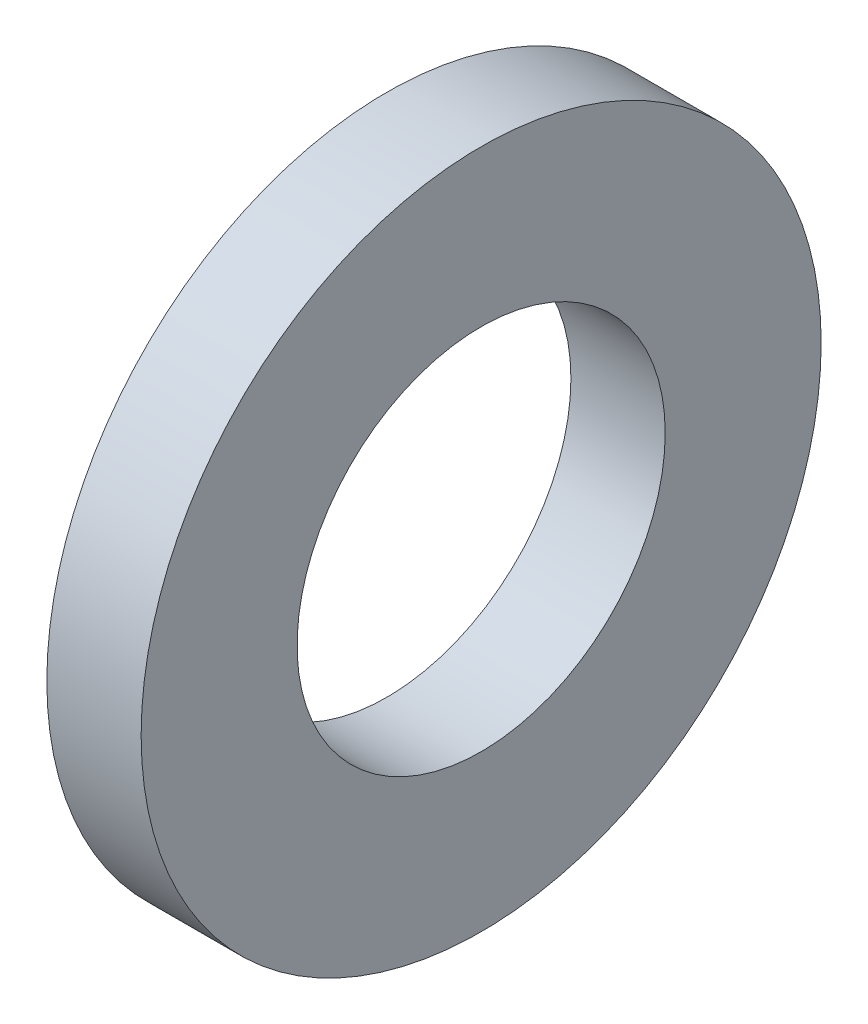
ISO-10303-21;
HEADER;
FILE_DESCRIPTION(('STEP AP214'),'2;1');
FILE_NAME('part.step','',(''),(''),'','','');
FILE_SCHEMA(('AUTOMOTIVE_DESIGN { 1 0 10303 214 1 1 1 1 }'));
ENDSEC;
DATA;
#1=APPLICATION_CONTEXT('core data for automotive mechanical design processes');
#2=APPLICATION_PROTOCOL_DEFINITION('international standard','automotive_design',2000,#1);
#3=PRODUCT_CONTEXT('',#1,'mechanical');
#4=PRODUCT('Part','Part','',(#3));
#5=PRODUCT_RELATED_PRODUCT_CATEGORY('part','',(#4));
#6=PRODUCT_DEFINITION_FORMATION('','',#4);
#7=PRODUCT_DEFINITION_CONTEXT('part definition',#1,'design');
#8=PRODUCT_DEFINITION('design','',#6,#7);
#9=PRODUCT_DEFINITION_SHAPE('','',#8);
#10=(LENGTH_UNIT() NAMED_UNIT(*) SI_UNIT(.MILLI.,.METRE.));
#11=(NAMED_UNIT(*) PLANE_ANGLE_UNIT() SI_UNIT($,.RADIAN.));
#12=(NAMED_UNIT(*) SI_UNIT($,.STERADIAN.) SOLID_ANGLE_UNIT());
#13=UNCERTAINTY_MEASURE_WITH_UNIT(LENGTH_MEASURE(1.E-05),#10,'distance_accuracy_value','');
#14=(GEOMETRIC_REPRESENTATION_CONTEXT(3) GLOBAL_UNCERTAINTY_ASSIGNED_CONTEXT((#13)) GLOBAL_UNIT_ASSIGNED_CONTEXT((#10,
#11,#12)) REPRESENTATION_CONTEXT('',''));
#15=CARTESIAN_POINT('',(0.,0.,0.));
#16=DIRECTION('',(0.,0.,1.));
#17=DIRECTION('',(1.,0.,0.));
#18=AXIS2_PLACEMENT_3D('',#15,#16,#17);
#19=CARTESIAN_POINT('',(1.3208,0.,0.));
#20=DIRECTION('',(1.,0.,0.));
#21=DIRECTION('',(0.,0.,-1.));
#22=AXIS2_PLACEMENT_3D('',#19,#20,#21);
#23=PLANE('',#22);
#24=CARTESIAN_POINT('',(1.3208,0.,0.));
#25=DIRECTION('',(1.,0.,0.));
#26=DIRECTION('',(0.,0.,-1.));
#27=AXIS2_PLACEMENT_3D('',#24,#25,#26);
#28=CIRCLE('',#27,4.7625);
#29=CARTESIAN_POINT('',(1.3208,0.,-4.7625));
#30=VERTEX_POINT('',#29);
#31=EDGE_CURVE('E10',#30,#30,#28,.T.);
#32=ORIENTED_EDGE('',*,*,#31,.T.);
#33=EDGE_LOOP('',(#32));
#34=FACE_BOUND('',#33,.T.);
#35=CARTESIAN_POINT('',(1.3208,0.,0.));
#36=DIRECTION('',(1.,0.,0.));
#37=DIRECTION('',(0.,0.,-1.));
#38=AXIS2_PLACEMENT_3D('',#35,#36,#37);
#39=CIRCLE('',#38,2.5781);
#40=CARTESIAN_POINT('',(1.3208,0.,-2.5781));
#41=VERTEX_POINT('',#40);
#42=EDGE_CURVE('E41',#41,#41,#39,.T.);
#43=ORIENTED_EDGE('',*,*,#42,.F.);
#44=EDGE_LOOP('',(#43));
#45=FACE_BOUND('',#44,.T.);
#46=ADVANCED_FACE('F30',(#34,#45),#23,.T.);
#47=CARTESIAN_POINT('',(0.,0.,0.));
#48=DIRECTION('',(1.,0.,0.));
#49=DIRECTION('',(0.,0.,-1.));
#50=AXIS2_PLACEMENT_3D('',#47,#48,#49);
#51=PLANE('',#50);
#52=CARTESIAN_POINT('',(0.,0.,0.));
#53=DIRECTION('',(1.,0.,0.));
#54=DIRECTION('',(0.,0.,-1.));
#55=AXIS2_PLACEMENT_3D('',#52,#53,#54);
#56=CIRCLE('',#55,4.7625);
#57=CARTESIAN_POINT('',(0.,0.,-4.7625));
#58=VERTEX_POINT('',#57);
#59=EDGE_CURVE('E34',#58,#58,#56,.T.);
#60=ORIENTED_EDGE('',*,*,#59,.F.);
#61=EDGE_LOOP('',(#60));
#62=FACE_BOUND('',#61,.T.);
#63=CARTESIAN_POINT('',(0.,0.,0.));
#64=DIRECTION('',(1.,0.,0.));
#65=DIRECTION('',(0.,0.,-1.));
#66=AXIS2_PLACEMENT_3D('',#63,#64,#65);
#67=CIRCLE('',#66,2.5781);
#68=CARTESIAN_POINT('',(0.,0.,-2.5781));
#69=VERTEX_POINT('',#68);
#70=EDGE_CURVE('E43',#69,#69,#67,.T.);
#71=ORIENTED_EDGE('',*,*,#70,.T.);
#72=EDGE_LOOP('',(#71));
#73=FACE_BOUND('',#72,.T.);
#74=ADVANCED_FACE('F53',(#62,#73),#51,.F.);
#75=CARTESIAN_POINT('',(1.3208,0.,0.));
#76=DIRECTION('',(-1.,0.,0.));
#77=DIRECTION('',(0.,0.,1.));
#78=AXIS2_PLACEMENT_3D('',#75,#76,#77);
#79=CYLINDRICAL_SURFACE('',#78,4.7625);
#80=ORIENTED_EDGE('',*,*,#31,.F.);
#81=EDGE_LOOP('',(#80));
#82=FACE_BOUND('',#81,.T.);
#83=ORIENTED_EDGE('',*,*,#59,.T.);
#84=EDGE_LOOP('',(#83));
#85=FACE_BOUND('',#84,.T.);
#86=ADVANCED_FACE('F32',(#82,#85),#79,.T.);
#87=CARTESIAN_POINT('',(1.3208,0.,0.));
#88=DIRECTION('',(-1.,0.,0.));
#89=DIRECTION('',(0.,0.,1.));
#90=AXIS2_PLACEMENT_3D('',#87,#88,#89);
#91=CYLINDRICAL_SURFACE('',#90,2.5781);
#92=ORIENTED_EDGE('',*,*,#42,.T.);
#93=EDGE_LOOP('',(#92));
#94=FACE_BOUND('',#93,.T.);
#95=ORIENTED_EDGE('',*,*,#70,.F.);
#96=EDGE_LOOP('',(#95));
#97=FACE_BOUND('',#96,.T.);
#98=ADVANCED_FACE('F49',(#94,#97),#91,.F.);
#99=CLOSED_SHELL('',(#46,#74,#86,#98));
#100=MANIFOLD_SOLID_BREP('B2',#99);
#101=ADVANCED_BREP_SHAPE_REPRESENTATION('',(#18,#100),#14);
#102=SHAPE_DEFINITION_REPRESENTATION(#9,#101);
ENDSEC;
END-ISO-10303-21;
